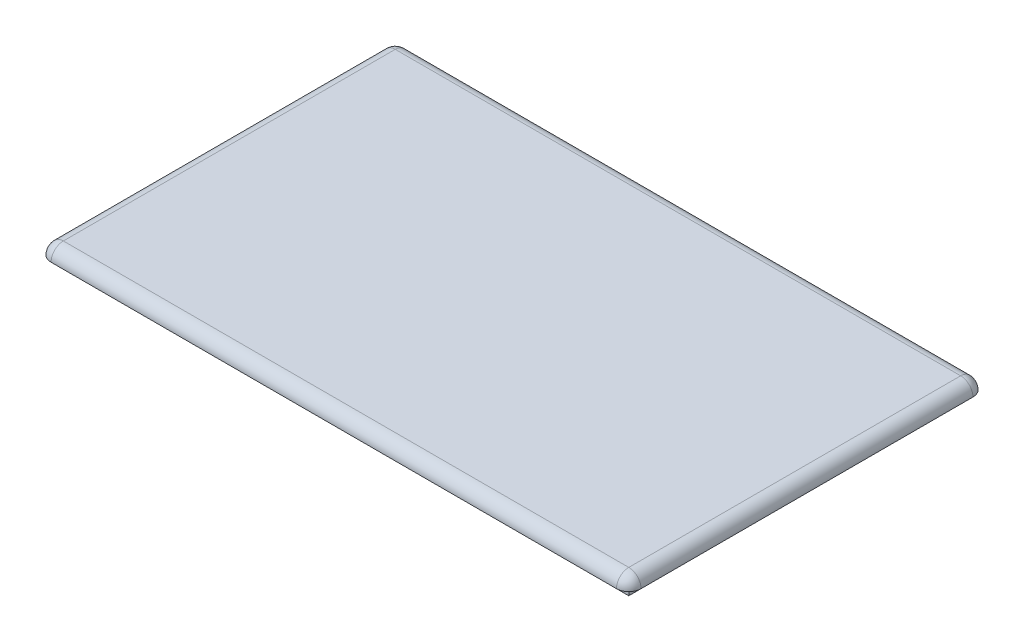
ISO-10303-21;
HEADER;
FILE_DESCRIPTION(('STEP AP214'),'2;1');
FILE_NAME('part.step','',(''),(''),'','','');
FILE_SCHEMA(('AUTOMOTIVE_DESIGN { 1 0 10303 214 1 1 1 1 }'));
ENDSEC;
DATA;
#1=APPLICATION_CONTEXT('core data for automotive mechanical design processes');
#2=APPLICATION_PROTOCOL_DEFINITION('international standard','automotive_design',2000,#1);
#3=PRODUCT_CONTEXT('',#1,'mechanical');
#4=PRODUCT('Part','Part','',(#3));
#5=PRODUCT_RELATED_PRODUCT_CATEGORY('part','',(#4));
#6=PRODUCT_DEFINITION_FORMATION('','',#4);
#7=PRODUCT_DEFINITION_CONTEXT('part definition',#1,'design');
#8=PRODUCT_DEFINITION('design','',#6,#7);
#9=PRODUCT_DEFINITION_SHAPE('','',#8);
#10=(LENGTH_UNIT() NAMED_UNIT(*) SI_UNIT(.MILLI.,.METRE.));
#11=(NAMED_UNIT(*) PLANE_ANGLE_UNIT() SI_UNIT($,.RADIAN.));
#12=(NAMED_UNIT(*) SI_UNIT($,.STERADIAN.) SOLID_ANGLE_UNIT());
#13=UNCERTAINTY_MEASURE_WITH_UNIT(LENGTH_MEASURE(1.E-05),#10,'distance_accuracy_value','');
#14=(GEOMETRIC_REPRESENTATION_CONTEXT(3) GLOBAL_UNCERTAINTY_ASSIGNED_CONTEXT((#13)) GLOBAL_UNIT_ASSIGNED_CONTEXT((#10,
#11,#12)) REPRESENTATION_CONTEXT('',''));
#15=CARTESIAN_POINT('',(0.,0.,0.));
#16=DIRECTION('',(0.,0.,1.));
#17=DIRECTION('',(1.,0.,0.));
#18=AXIS2_PLACEMENT_3D('',#15,#16,#17);
#19=CARTESIAN_POINT('',(-47.4569904526304,1.,-36.7515055467512));
#20=DIRECTION('',(1.,0.,0.));
#21=DIRECTION('',(0.,0.,-1.));
#22=AXIS2_PLACEMENT_3D('',#19,#20,#21);
#23=PLANE('',#22);
#24=DIRECTION('',(0.,0.,1.));
#25=VECTOR('',#24,1.);
#26=CARTESIAN_POINT('',(-47.4569904526304,0.,-36.7515055467512));
#27=LINE('',#26,#25);
#28=CARTESIAN_POINT('',(-47.4569904526304,0.,-36.7515055467512));
#29=VERTEX_POINT('',#28);
#30=CARTESIAN_POINT('',(-47.4569904526304,0.,-9.75150554675117));
#31=VERTEX_POINT('',#30);
#32=EDGE_CURVE('E139',#29,#31,#27,.T.);
#33=ORIENTED_EDGE('',*,*,#32,.T.);
#34=DIRECTION('',(0.,-1.,0.));
#35=VECTOR('',#34,1.);
#36=CARTESIAN_POINT('',(-47.4569904526304,1.,-9.75150554675117));
#37=LINE('',#36,#35);
#38=CARTESIAN_POINT('',(-47.4569904526304,1.,-9.75150554675117));
#39=VERTEX_POINT('',#38);
#40=EDGE_CURVE('E116',#39,#31,#37,.T.);
#41=ORIENTED_EDGE('',*,*,#40,.F.);
#42=DIRECTION('',(0.,0.,1.));
#43=VECTOR('',#42,1.);
#44=CARTESIAN_POINT('',(-47.4569904526304,1.,-36.7515055467512));
#45=LINE('',#44,#43);
#46=CARTESIAN_POINT('',(-47.4569904526304,1.,-36.7515055467512));
#47=VERTEX_POINT('',#46);
#48=EDGE_CURVE('E110',#47,#39,#45,.T.);
#49=ORIENTED_EDGE('',*,*,#48,.F.);
#50=DIRECTION('',(0.,-1.,0.));
#51=VECTOR('',#50,1.);
#52=CARTESIAN_POINT('',(-47.4569904526304,1.,-36.7515055467512));
#53=LINE('',#52,#51);
#54=EDGE_CURVE('E113',#47,#29,#53,.T.);
#55=ORIENTED_EDGE('',*,*,#54,.T.);
#56=EDGE_LOOP('',(#33,#41,#49,#55));
#57=FACE_BOUND('',#56,.T.);
#58=ADVANCED_FACE('F33',(#57),#23,.F.);
#59=CARTESIAN_POINT('',(-47.4569904526304,1.,-9.75150554675117));
#60=DIRECTION('',(0.,0.,-1.));
#61=DIRECTION('',(-1.,0.,0.));
#62=AXIS2_PLACEMENT_3D('',#59,#60,#61);
#63=PLANE('',#62);
#64=DIRECTION('',(1.,0.,0.));
#65=VECTOR('',#64,1.);
#66=CARTESIAN_POINT('',(-47.4569904526304,0.,-9.75150554675117));
#67=LINE('',#66,#65);
#68=CARTESIAN_POINT('',(-1.45699045263037,0.,-9.75150554675118));
#69=VERTEX_POINT('',#68);
#70=EDGE_CURVE('E141',#31,#69,#67,.T.);
#71=ORIENTED_EDGE('',*,*,#70,.T.);
#72=DIRECTION('',(0.,-1.,0.));
#73=VECTOR('',#72,1.);
#74=CARTESIAN_POINT('',(-1.45699045263037,1.,-9.75150554675118));
#75=LINE('',#74,#73);
#76=CARTESIAN_POINT('',(-1.45699045263037,1.,-9.75150554675118));
#77=VERTEX_POINT('',#76);
#78=EDGE_CURVE('E148',#77,#69,#75,.T.);
#79=ORIENTED_EDGE('',*,*,#78,.F.);
#80=DIRECTION('',(1.,0.,0.));
#81=VECTOR('',#80,1.);
#82=CARTESIAN_POINT('',(-47.4569904526304,1.,-9.75150554675117));
#83=LINE('',#82,#81);
#84=EDGE_CURVE('E120',#39,#77,#83,.T.);
#85=ORIENTED_EDGE('',*,*,#84,.F.);
#86=ORIENTED_EDGE('',*,*,#40,.T.);
#87=EDGE_LOOP('',(#71,#79,#85,#86));
#88=FACE_BOUND('',#87,.T.);
#89=ADVANCED_FACE('F202',(#88),#63,.F.);
#90=CARTESIAN_POINT('',(-1.45699045263037,1.,-36.7515055467512));
#91=DIRECTION('',(-1.,0.,0.));
#92=DIRECTION('',(0.,0.,1.));
#93=AXIS2_PLACEMENT_3D('',#90,#91,#92);
#94=PLANE('',#93);
#95=DIRECTION('',(0.,0.,-1.));
#96=VECTOR('',#95,1.);
#97=CARTESIAN_POINT('',(-1.45699045263037,0.,-36.7515055467512));
#98=LINE('',#97,#96);
#99=CARTESIAN_POINT('',(-1.45699045263037,0.,-36.7515055467512));
#100=VERTEX_POINT('',#99);
#101=EDGE_CURVE('E144',#69,#100,#98,.T.);
#102=ORIENTED_EDGE('',*,*,#101,.T.);
#103=DIRECTION('',(0.,-1.,0.));
#104=VECTOR('',#103,1.);
#105=CARTESIAN_POINT('',(-1.45699045263037,1.,-36.7515055467512));
#106=LINE('',#105,#104);
#107=CARTESIAN_POINT('',(-1.45699045263037,1.,-36.7515055467512));
#108=VERTEX_POINT('',#107);
#109=EDGE_CURVE('E130',#108,#100,#106,.T.);
#110=ORIENTED_EDGE('',*,*,#109,.F.);
#111=DIRECTION('',(0.,0.,-1.));
#112=VECTOR('',#111,1.);
#113=CARTESIAN_POINT('',(-1.45699045263037,1.,-36.7515055467512));
#114=LINE('',#113,#112);
#115=EDGE_CURVE('E134',#77,#108,#114,.T.);
#116=ORIENTED_EDGE('',*,*,#115,.F.);
#117=ORIENTED_EDGE('',*,*,#78,.T.);
#118=EDGE_LOOP('',(#102,#110,#116,#117));
#119=FACE_BOUND('',#118,.T.);
#120=ADVANCED_FACE('F205',(#119),#94,.F.);
#121=CARTESIAN_POINT('',(-47.4569904526304,1.,-36.7515055467512));
#122=DIRECTION('',(0.,0.,1.));
#123=DIRECTION('',(1.,0.,0.));
#124=AXIS2_PLACEMENT_3D('',#121,#122,#123);
#125=PLANE('',#124);
#126=DIRECTION('',(-1.,0.,0.));
#127=VECTOR('',#126,1.);
#128=CARTESIAN_POINT('',(-47.4569904526304,0.,-36.7515055467512));
#129=LINE('',#128,#127);
#130=EDGE_CURVE('E121',#100,#29,#129,.T.);
#131=ORIENTED_EDGE('',*,*,#130,.T.);
#132=ORIENTED_EDGE('',*,*,#54,.F.);
#133=DIRECTION('',(-1.,0.,0.));
#134=VECTOR('',#133,1.);
#135=CARTESIAN_POINT('',(-47.4569904526304,1.,-36.7515055467512));
#136=LINE('',#135,#134);
#137=EDGE_CURVE('E127',#108,#47,#136,.T.);
#138=ORIENTED_EDGE('',*,*,#137,.F.);
#139=ORIENTED_EDGE('',*,*,#109,.T.);
#140=EDGE_LOOP('',(#131,#132,#138,#139));
#141=FACE_BOUND('',#140,.T.);
#142=ADVANCED_FACE('F125',(#141),#125,.F.);
#143=CARTESIAN_POINT('',(0.,0.,0.));
#144=DIRECTION('',(0.,1.,0.));
#145=DIRECTION('',(0.,0.,1.));
#146=AXIS2_PLACEMENT_3D('',#143,#144,#145);
#147=PLANE('',#146);
#148=ORIENTED_EDGE('',*,*,#32,.F.);
#149=ORIENTED_EDGE('',*,*,#130,.F.);
#150=ORIENTED_EDGE('',*,*,#101,.F.);
#151=ORIENTED_EDGE('',*,*,#70,.F.);
#152=EDGE_LOOP('',(#148,#149,#150,#151));
#153=FACE_BOUND('',#152,.T.);
#154=ADVANCED_FACE('F207',(#153),#147,.F.);
#155=CARTESIAN_POINT('',(0.,1.,0.));
#156=DIRECTION('',(0.,1.,0.));
#157=DIRECTION('',(0.,0.,1.));
#158=AXIS2_PLACEMENT_3D('',#155,#156,#157);
#159=PLANE('',#158);
#160=DIRECTION('',(-1.,0.,0.));
#161=VECTOR('',#160,1.);
#162=CARTESIAN_POINT('',(-48.4569904526304,1.,-37.7515055467512));
#163=LINE('',#162,#161);
#164=CARTESIAN_POINT('',(-1.45699045263037,1.,-37.7515055467512));
#165=VERTEX_POINT('',#164);
#166=CARTESIAN_POINT('',(-47.4569904526304,1.,-37.7515055467512));
#167=VERTEX_POINT('',#166);
#168=EDGE_CURVE('E142',#165,#167,#163,.T.);
#169=ORIENTED_EDGE('',*,*,#168,.F.);
#170=CARTESIAN_POINT('',(-1.45699045263037,1.,-36.7515055467512));
#171=DIRECTION('',(0.,1.,0.));
#172=DIRECTION('',(0.,0.,1.));
#173=AXIS2_PLACEMENT_3D('',#170,#171,#172);
#174=CIRCLE('',#173,1.);
#175=CARTESIAN_POINT('',(-0.456990452630368,1.,-36.7515055467512));
#176=VERTEX_POINT('',#175);
#177=EDGE_CURVE('E11',#165,#176,#174,.F.);
#178=ORIENTED_EDGE('',*,*,#177,.T.);
#179=DIRECTION('',(0.,0.,-1.));
#180=VECTOR('',#179,1.);
#181=CARTESIAN_POINT('',(-0.456990452630368,1.,-37.7515055467512));
#182=LINE('',#181,#180);
#183=CARTESIAN_POINT('',(-0.456990452630368,1.,-9.75150554675118));
#184=VERTEX_POINT('',#183);
#185=EDGE_CURVE('E53',#184,#176,#182,.T.);
#186=ORIENTED_EDGE('',*,*,#185,.F.);
#187=CARTESIAN_POINT('',(-1.45699045263037,1.,-9.75150554675117));
#188=DIRECTION('',(0.,1.,0.));
#189=DIRECTION('',(0.,0.,1.));
#190=AXIS2_PLACEMENT_3D('',#187,#188,#189);
#191=CIRCLE('',#190,1.);
#192=CARTESIAN_POINT('',(-1.45699045263037,1.,-8.75150554675117));
#193=VERTEX_POINT('',#192);
#194=EDGE_CURVE('E42',#184,#193,#191,.F.);
#195=ORIENTED_EDGE('',*,*,#194,.T.);
#196=DIRECTION('',(1.,0.,0.));
#197=VECTOR('',#196,1.);
#198=CARTESIAN_POINT('',(-48.4569904526304,1.,-8.75150554675117));
#199=LINE('',#198,#197);
#200=CARTESIAN_POINT('',(-47.4569904526304,1.,-8.75150554675117));
#201=VERTEX_POINT('',#200);
#202=EDGE_CURVE('E192',#201,#193,#199,.T.);
#203=ORIENTED_EDGE('',*,*,#202,.F.);
#204=CARTESIAN_POINT('',(-47.4569904526304,1.,-9.75150554675117));
#205=DIRECTION('',(0.,1.,0.));
#206=DIRECTION('',(0.,0.,1.));
#207=AXIS2_PLACEMENT_3D('',#204,#205,#206);
#208=CIRCLE('',#207,1.);
#209=CARTESIAN_POINT('',(-48.4569904526304,1.,-9.75150554675118));
#210=VERTEX_POINT('',#209);
#211=EDGE_CURVE('E161',#201,#210,#208,.F.);
#212=ORIENTED_EDGE('',*,*,#211,.T.);
#213=DIRECTION('',(0.,0.,1.));
#214=VECTOR('',#213,1.);
#215=CARTESIAN_POINT('',(-48.4569904526304,1.,-37.7515055467512));
#216=LINE('',#215,#214);
#217=CARTESIAN_POINT('',(-48.4569904526304,1.,-36.7515055467512));
#218=VERTEX_POINT('',#217);
#219=EDGE_CURVE('E186',#218,#210,#216,.T.);
#220=ORIENTED_EDGE('',*,*,#219,.F.);
#221=CARTESIAN_POINT('',(-47.4569904526304,1.,-36.7515055467512));
#222=DIRECTION('',(0.,1.,0.));
#223=DIRECTION('',(0.,0.,1.));
#224=AXIS2_PLACEMENT_3D('',#221,#222,#223);
#225=CIRCLE('',#224,1.);
#226=EDGE_CURVE('E163',#218,#167,#225,.F.);
#227=ORIENTED_EDGE('',*,*,#226,.T.);
#228=EDGE_LOOP('',(#169,#178,#186,#195,#203,#212,#220,#227));
#229=FACE_BOUND('',#228,.T.);
#230=ORIENTED_EDGE('',*,*,#137,.T.);
#231=ORIENTED_EDGE('',*,*,#48,.T.);
#232=ORIENTED_EDGE('',*,*,#84,.T.);
#233=ORIENTED_EDGE('',*,*,#115,.T.);
#234=EDGE_LOOP('',(#230,#231,#232,#233));
#235=FACE_BOUND('',#234,.T.);
#236=ADVANCED_FACE('F132',(#229,#235),#159,.F.);
#237=CARTESIAN_POINT('',(0.,2.,0.));
#238=DIRECTION('',(0.,1.,0.));
#239=DIRECTION('',(0.,0.,1.));
#240=AXIS2_PLACEMENT_3D('',#237,#238,#239);
#241=PLANE('',#240);
#242=DIRECTION('',(0.,0.,1.));
#243=VECTOR('',#242,1.);
#244=CARTESIAN_POINT('',(-47.4569904526304,2.,-8.75150554675117));
#245=LINE('',#244,#243);
#246=CARTESIAN_POINT('',(-47.4569904526304,2.,-36.7515055467512));
#247=VERTEX_POINT('',#246);
#248=CARTESIAN_POINT('',(-47.4569904526304,2.,-9.75150554675117));
#249=VERTEX_POINT('',#248);
#250=EDGE_CURVE('E156',#247,#249,#245,.T.);
#251=ORIENTED_EDGE('',*,*,#250,.T.);
#252=DIRECTION('',(1.,0.,0.));
#253=VECTOR('',#252,1.);
#254=CARTESIAN_POINT('',(-0.456990452630368,2.,-9.75150554675117));
#255=LINE('',#254,#253);
#256=CARTESIAN_POINT('',(-1.45699045263037,2.,-9.75150554675117));
#257=VERTEX_POINT('',#256);
#258=EDGE_CURVE('E158',#249,#257,#255,.T.);
#259=ORIENTED_EDGE('',*,*,#258,.T.);
#260=DIRECTION('',(0.,0.,-1.));
#261=VECTOR('',#260,1.);
#262=CARTESIAN_POINT('',(-1.45699045263037,2.,-37.7515055467512));
#263=LINE('',#262,#261);
#264=CARTESIAN_POINT('',(-1.45699045263037,2.,-36.7515055467512));
#265=VERTEX_POINT('',#264);
#266=EDGE_CURVE('E152',#257,#265,#263,.T.);
#267=ORIENTED_EDGE('',*,*,#266,.T.);
#268=DIRECTION('',(-1.,0.,0.));
#269=VECTOR('',#268,1.);
#270=CARTESIAN_POINT('',(-48.4569904526304,2.,-36.7515055467512));
#271=LINE('',#270,#269);
#272=EDGE_CURVE('E154',#265,#247,#271,.T.);
#273=ORIENTED_EDGE('',*,*,#272,.T.);
#274=EDGE_LOOP('',(#251,#259,#267,#273));
#275=FACE_BOUND('',#274,.T.);
#276=ADVANCED_FACE('F214',(#275),#241,.T.);
#277=CARTESIAN_POINT('',(0.,1.,-36.7515055467512));
#278=DIRECTION('',(1.,0.,0.));
#279=DIRECTION('',(0.,0.,-1.));
#280=AXIS2_PLACEMENT_3D('',#277,#278,#279);
#281=CYLINDRICAL_SURFACE('',#280,1.);
#282=CARTESIAN_POINT('',(-1.45699045263037,1.,-36.7515055467512));
#283=DIRECTION('',(1.,0.,0.));
#284=DIRECTION('',(0.,1.,0.));
#285=AXIS2_PLACEMENT_3D('',#282,#283,#284);
#286=CIRCLE('',#285,1.);
#287=EDGE_CURVE('E181',#165,#265,#286,.T.);
#288=ORIENTED_EDGE('',*,*,#287,.F.);
#289=ORIENTED_EDGE('',*,*,#168,.T.);
#290=CARTESIAN_POINT('',(-47.4569904526304,1.,-36.7515055467512));
#291=DIRECTION('',(-1.,0.,0.));
#292=DIRECTION('',(0.,0.,1.));
#293=AXIS2_PLACEMENT_3D('',#290,#291,#292);
#294=CIRCLE('',#293,1.);
#295=EDGE_CURVE('E37',#247,#167,#294,.T.);
#296=ORIENTED_EDGE('',*,*,#295,.F.);
#297=ORIENTED_EDGE('',*,*,#272,.F.);
#298=EDGE_LOOP('',(#288,#289,#296,#297));
#299=FACE_BOUND('',#298,.T.);
#300=ADVANCED_FACE('F35',(#299),#281,.T.);
#301=CARTESIAN_POINT('',(-47.4569904526304,1.,-36.7515055467512));
#302=DIRECTION('',(0.,0.,1.));
#303=DIRECTION('',(1.,0.,0.));
#304=AXIS2_PLACEMENT_3D('',#301,#302,#303);
#305=SPHERICAL_SURFACE('',#304,1.);
#306=ORIENTED_EDGE('',*,*,#295,.T.);
#307=ORIENTED_EDGE('',*,*,#226,.F.);
#308=CARTESIAN_POINT('',(-47.4569904526304,1.,-36.7515055467512));
#309=DIRECTION('',(0.,0.,-1.));
#310=DIRECTION('',(-1.,0.,0.));
#311=AXIS2_PLACEMENT_3D('',#308,#309,#310);
#312=CIRCLE('',#311,1.);
#313=EDGE_CURVE('E179',#247,#218,#312,.F.);
#314=ORIENTED_EDGE('',*,*,#313,.F.);
#315=EDGE_LOOP('',(#306,#307,#314));
#316=FACE_BOUND('',#315,.T.);
#317=ADVANCED_FACE('F246',(#316),#305,.T.);
#318=CARTESIAN_POINT('',(-1.45699045263037,1.,-36.7515055467512));
#319=DIRECTION('',(0.,0.,1.));
#320=DIRECTION('',(1.,0.,0.));
#321=AXIS2_PLACEMENT_3D('',#318,#319,#320);
#322=SPHERICAL_SURFACE('',#321,1.);
#323=ORIENTED_EDGE('',*,*,#177,.F.);
#324=ORIENTED_EDGE('',*,*,#287,.T.);
#325=CARTESIAN_POINT('',(-1.45699045263037,1.,-36.7515055467512));
#326=DIRECTION('',(0.,0.,-1.));
#327=DIRECTION('',(-1.,0.,0.));
#328=AXIS2_PLACEMENT_3D('',#325,#326,#327);
#329=CIRCLE('',#328,1.);
#330=EDGE_CURVE('E176',#176,#265,#329,.F.);
#331=ORIENTED_EDGE('',*,*,#330,.F.);
#332=EDGE_LOOP('',(#323,#324,#331));
#333=FACE_BOUND('',#332,.T.);
#334=ADVANCED_FACE('F244',(#333),#322,.T.);
#335=CARTESIAN_POINT('',(-47.4569904526304,1.,0.));
#336=DIRECTION('',(0.,0.,-1.));
#337=DIRECTION('',(-1.,0.,0.));
#338=AXIS2_PLACEMENT_3D('',#335,#336,#337);
#339=CYLINDRICAL_SURFACE('',#338,1.);
#340=ORIENTED_EDGE('',*,*,#313,.T.);
#341=ORIENTED_EDGE('',*,*,#219,.T.);
#342=CARTESIAN_POINT('',(-47.4569904526304,1.,-9.75150554675117));
#343=DIRECTION('',(0.,0.,1.));
#344=DIRECTION('',(1.,0.,0.));
#345=AXIS2_PLACEMENT_3D('',#342,#343,#344);
#346=CIRCLE('',#345,1.);
#347=EDGE_CURVE('E173',#249,#210,#346,.T.);
#348=ORIENTED_EDGE('',*,*,#347,.F.);
#349=ORIENTED_EDGE('',*,*,#250,.F.);
#350=EDGE_LOOP('',(#340,#341,#348,#349));
#351=FACE_BOUND('',#350,.T.);
#352=ADVANCED_FACE('F240',(#351),#339,.T.);
#353=CARTESIAN_POINT('',(-1.45699045263037,1.,0.));
#354=DIRECTION('',(0.,0.,1.));
#355=DIRECTION('',(1.,0.,0.));
#356=AXIS2_PLACEMENT_3D('',#353,#354,#355);
#357=CYLINDRICAL_SURFACE('',#356,1.);
#358=ORIENTED_EDGE('',*,*,#330,.T.);
#359=ORIENTED_EDGE('',*,*,#266,.F.);
#360=CARTESIAN_POINT('',(-1.45699045263037,1.,-9.75150554675117));
#361=DIRECTION('',(0.,0.,1.));
#362=DIRECTION('',(1.,0.,0.));
#363=AXIS2_PLACEMENT_3D('',#360,#361,#362);
#364=CIRCLE('',#363,1.);
#365=EDGE_CURVE('E170',#184,#257,#364,.T.);
#366=ORIENTED_EDGE('',*,*,#365,.F.);
#367=ORIENTED_EDGE('',*,*,#185,.T.);
#368=EDGE_LOOP('',(#358,#359,#366,#367));
#369=FACE_BOUND('',#368,.T.);
#370=ADVANCED_FACE('F236',(#369),#357,.T.);
#371=CARTESIAN_POINT('',(-47.4569904526304,1.,-9.75150554675117));
#372=DIRECTION('',(0.,0.,1.));
#373=DIRECTION('',(1.,0.,0.));
#374=AXIS2_PLACEMENT_3D('',#371,#372,#373);
#375=SPHERICAL_SURFACE('',#374,1.);
#376=ORIENTED_EDGE('',*,*,#347,.T.);
#377=ORIENTED_EDGE('',*,*,#211,.F.);
#378=CARTESIAN_POINT('',(-47.4569904526304,1.,-9.75150554675117));
#379=DIRECTION('',(-1.,0.,0.));
#380=DIRECTION('',(0.,0.,1.));
#381=AXIS2_PLACEMENT_3D('',#378,#379,#380);
#382=CIRCLE('',#381,1.);
#383=EDGE_CURVE('E168',#249,#201,#382,.F.);
#384=ORIENTED_EDGE('',*,*,#383,.F.);
#385=EDGE_LOOP('',(#376,#377,#384));
#386=FACE_BOUND('',#385,.T.);
#387=ADVANCED_FACE('F232',(#386),#375,.T.);
#388=CARTESIAN_POINT('',(-1.45699045263037,1.,-9.75150554675117));
#389=DIRECTION('',(0.,0.,1.));
#390=DIRECTION('',(1.,0.,0.));
#391=AXIS2_PLACEMENT_3D('',#388,#389,#390);
#392=SPHERICAL_SURFACE('',#391,1.);
#393=ORIENTED_EDGE('',*,*,#194,.F.);
#394=ORIENTED_EDGE('',*,*,#365,.T.);
#395=CARTESIAN_POINT('',(-1.45699045263037,1.,-9.75150554675117));
#396=DIRECTION('',(1.,0.,0.));
#397=DIRECTION('',(0.,0.,-1.));
#398=AXIS2_PLACEMENT_3D('',#395,#396,#397);
#399=CIRCLE('',#398,1.);
#400=EDGE_CURVE('E166',#193,#257,#399,.F.);
#401=ORIENTED_EDGE('',*,*,#400,.F.);
#402=EDGE_LOOP('',(#393,#394,#401));
#403=FACE_BOUND('',#402,.T.);
#404=ADVANCED_FACE('F228',(#403),#392,.T.);
#405=CARTESIAN_POINT('',(0.,1.,-9.75150554675117));
#406=DIRECTION('',(-1.,0.,0.));
#407=DIRECTION('',(0.,0.,1.));
#408=AXIS2_PLACEMENT_3D('',#405,#406,#407);
#409=CYLINDRICAL_SURFACE('',#408,1.);
#410=ORIENTED_EDGE('',*,*,#383,.T.);
#411=ORIENTED_EDGE('',*,*,#202,.T.);
#412=ORIENTED_EDGE('',*,*,#400,.T.);
#413=ORIENTED_EDGE('',*,*,#258,.F.);
#414=EDGE_LOOP('',(#410,#411,#412,#413));
#415=FACE_BOUND('',#414,.T.);
#416=ADVANCED_FACE('F225',(#415),#409,.T.);
#417=CLOSED_SHELL('',(#58,#89,#120,#142,#154,#236,#276,#300,#317,#334,#352,#370,#387,#404,#416));
#418=MANIFOLD_SOLID_BREP('B2',#417);
#419=ADVANCED_BREP_SHAPE_REPRESENTATION('',(#18,#418),#14);
#420=SHAPE_DEFINITION_REPRESENTATION(#9,#419);
ENDSEC;
END-ISO-10303-21;
